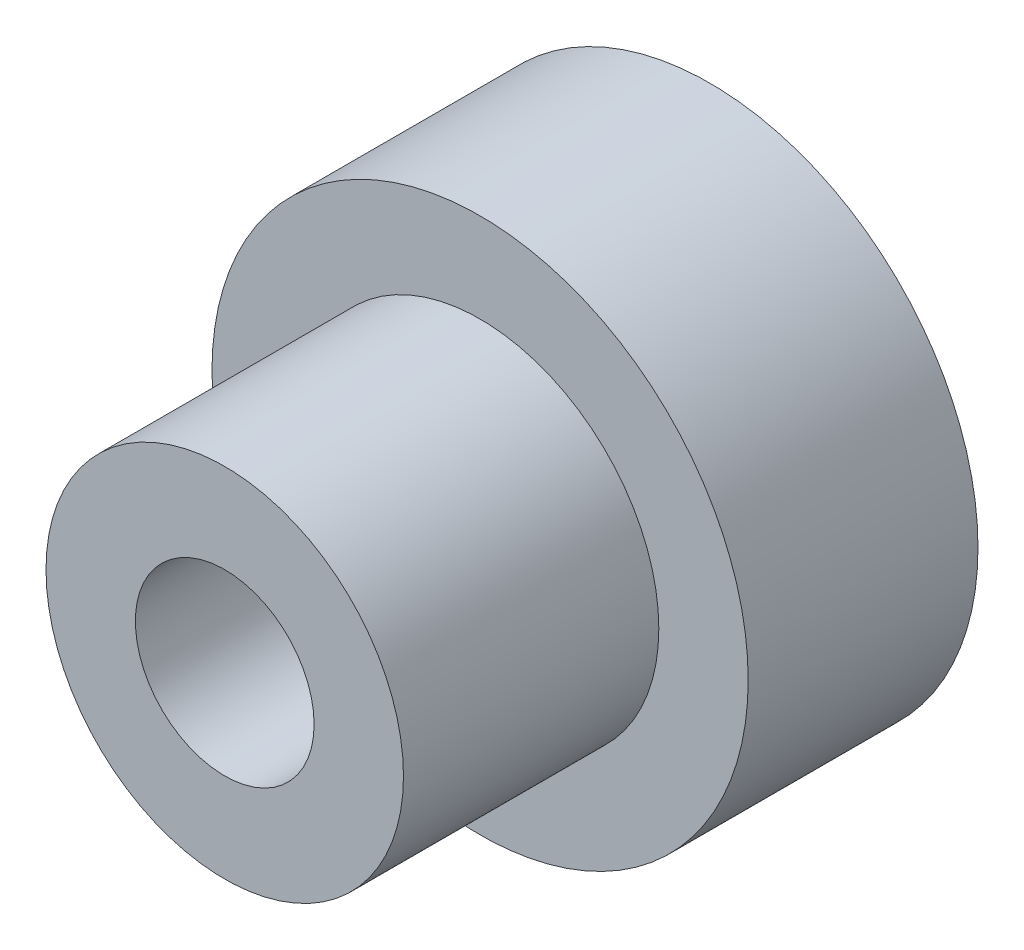
ISO-10303-21;
HEADER;
FILE_DESCRIPTION(('STEP AP214'),'2;1');
FILE_NAME('part.step','',(''),(''),'','','');
FILE_SCHEMA(('AUTOMOTIVE_DESIGN { 1 0 10303 214 1 1 1 1 }'));
ENDSEC;
DATA;
#1=APPLICATION_CONTEXT('core data for automotive mechanical design processes');
#2=APPLICATION_PROTOCOL_DEFINITION('international standard','automotive_design',2000,#1);
#3=PRODUCT_CONTEXT('',#1,'mechanical');
#4=PRODUCT('Part','Part','',(#3));
#5=PRODUCT_RELATED_PRODUCT_CATEGORY('part','',(#4));
#6=PRODUCT_DEFINITION_FORMATION('','',#4);
#7=PRODUCT_DEFINITION_CONTEXT('part definition',#1,'design');
#8=PRODUCT_DEFINITION('design','',#6,#7);
#9=PRODUCT_DEFINITION_SHAPE('','',#8);
#10=(LENGTH_UNIT() NAMED_UNIT(*) SI_UNIT(.MILLI.,.METRE.));
#11=(NAMED_UNIT(*) PLANE_ANGLE_UNIT() SI_UNIT($,.RADIAN.));
#12=(NAMED_UNIT(*) SI_UNIT($,.STERADIAN.) SOLID_ANGLE_UNIT());
#13=UNCERTAINTY_MEASURE_WITH_UNIT(LENGTH_MEASURE(1.E-05),#10,'distance_accuracy_value','');
#14=(GEOMETRIC_REPRESENTATION_CONTEXT(3) GLOBAL_UNCERTAINTY_ASSIGNED_CONTEXT((#13)) GLOBAL_UNIT_ASSIGNED_CONTEXT((#10,
#11,#12)) REPRESENTATION_CONTEXT('',''));
#15=CARTESIAN_POINT('',(0.,0.,0.));
#16=DIRECTION('',(0.,0.,1.));
#17=DIRECTION('',(1.,0.,0.));
#18=AXIS2_PLACEMENT_3D('',#15,#16,#17);
#19=CARTESIAN_POINT('',(0.,0.,-9.));
#20=DIRECTION('',(0.,0.,1.));
#21=DIRECTION('',(1.,0.,0.));
#22=AXIS2_PLACEMENT_3D('',#19,#20,#21);
#23=CYLINDRICAL_SURFACE('',#22,3.5);
#24=CARTESIAN_POINT('',(0.,0.,-9.));
#25=DIRECTION('',(0.,0.,1.));
#26=DIRECTION('',(1.,0.,0.));
#27=AXIS2_PLACEMENT_3D('',#24,#25,#26);
#28=CIRCLE('',#27,3.5);
#29=CARTESIAN_POINT('',(3.5,0.,-9.));
#30=VERTEX_POINT('',#29);
#31=EDGE_CURVE('E65',#30,#30,#28,.T.);
#32=ORIENTED_EDGE('',*,*,#31,.F.);
#33=EDGE_LOOP('',(#32));
#34=FACE_BOUND('',#33,.T.);
#35=CARTESIAN_POINT('',(0.,0.,-5.5));
#36=DIRECTION('',(0.,0.,1.));
#37=DIRECTION('',(1.,0.,0.));
#38=AXIS2_PLACEMENT_3D('',#35,#36,#37);
#39=CIRCLE('',#38,3.5);
#40=CARTESIAN_POINT('',(3.5,0.,-5.5));
#41=VERTEX_POINT('',#40);
#42=EDGE_CURVE('E38',#41,#41,#39,.F.);
#43=ORIENTED_EDGE('',*,*,#42,.F.);
#44=EDGE_LOOP('',(#43));
#45=FACE_BOUND('',#44,.T.);
#46=ADVANCED_FACE('F34',(#34,#45),#23,.F.);
#47=CARTESIAN_POINT('',(0.,0.,10.));
#48=DIRECTION('',(0.,0.,-1.));
#49=DIRECTION('',(-1.,0.,0.));
#50=AXIS2_PLACEMENT_3D('',#47,#48,#49);
#51=CYLINDRICAL_SURFACE('',#50,7.);
#52=CARTESIAN_POINT('',(0.,0.,10.));
#53=DIRECTION('',(0.,0.,1.));
#54=DIRECTION('',(1.,0.,0.));
#55=AXIS2_PLACEMENT_3D('',#52,#53,#54);
#56=CIRCLE('',#55,7.);
#57=CARTESIAN_POINT('',(7.,0.,10.));
#58=VERTEX_POINT('',#57);
#59=EDGE_CURVE('E10',#58,#58,#56,.T.);
#60=ORIENTED_EDGE('',*,*,#59,.F.);
#61=EDGE_LOOP('',(#60));
#62=FACE_BOUND('',#61,.T.);
#63=CARTESIAN_POINT('',(0.,0.,0.));
#64=DIRECTION('',(0.,0.,-1.));
#65=DIRECTION('',(-1.,0.,0.));
#66=AXIS2_PLACEMENT_3D('',#63,#64,#65);
#67=CIRCLE('',#66,7.);
#68=CARTESIAN_POINT('',(-7.,0.,0.));
#69=VERTEX_POINT('',#68);
#70=EDGE_CURVE('E42',#69,#69,#67,.T.);
#71=ORIENTED_EDGE('',*,*,#70,.F.);
#72=EDGE_LOOP('',(#71));
#73=FACE_BOUND('',#72,.T.);
#74=ADVANCED_FACE('F36',(#62,#73),#51,.T.);
#75=CARTESIAN_POINT('',(0.,0.,10.));
#76=DIRECTION('',(0.,0.,1.));
#77=DIRECTION('',(1.,0.,0.));
#78=AXIS2_PLACEMENT_3D('',#75,#76,#77);
#79=PLANE('',#78);
#80=CARTESIAN_POINT('',(0.,0.,10.));
#81=DIRECTION('',(0.,0.,1.));
#82=DIRECTION('',(1.,0.,0.));
#83=AXIS2_PLACEMENT_3D('',#80,#81,#82);
#84=CIRCLE('',#83,3.5);
#85=CARTESIAN_POINT('',(3.5,0.,10.));
#86=VERTEX_POINT('',#85);
#87=EDGE_CURVE('E56',#86,#86,#84,.T.);
#88=ORIENTED_EDGE('',*,*,#87,.F.);
#89=EDGE_LOOP('',(#88));
#90=FACE_BOUND('',#89,.T.);
#91=ORIENTED_EDGE('',*,*,#59,.T.);
#92=EDGE_LOOP('',(#91));
#93=FACE_BOUND('',#92,.T.);
#94=ADVANCED_FACE('F97',(#90,#93),#79,.T.);
#95=CARTESIAN_POINT('',(0.,0.,-9.));
#96=DIRECTION('',(0.,0.,1.));
#97=DIRECTION('',(1.,0.,0.));
#98=AXIS2_PLACEMENT_3D('',#95,#96,#97);
#99=CYLINDRICAL_SURFACE('',#98,10.5);
#100=CARTESIAN_POINT('',(0.,0.,-9.));
#101=DIRECTION('',(0.,0.,-1.));
#102=DIRECTION('',(-1.,0.,0.));
#103=AXIS2_PLACEMENT_3D('',#100,#101,#102);
#104=CIRCLE('',#103,10.5);
#105=CARTESIAN_POINT('',(-10.5,0.,-9.));
#106=VERTEX_POINT('',#105);
#107=EDGE_CURVE('E47',#106,#106,#104,.T.);
#108=ORIENTED_EDGE('',*,*,#107,.F.);
#109=EDGE_LOOP('',(#108));
#110=FACE_BOUND('',#109,.T.);
#111=CARTESIAN_POINT('',(0.,0.,0.));
#112=DIRECTION('',(0.,0.,-1.));
#113=DIRECTION('',(-1.,0.,0.));
#114=AXIS2_PLACEMENT_3D('',#111,#112,#113);
#115=CIRCLE('',#114,10.5);
#116=CARTESIAN_POINT('',(-10.5,0.,0.));
#117=VERTEX_POINT('',#116);
#118=EDGE_CURVE('E68',#117,#117,#115,.T.);
#119=ORIENTED_EDGE('',*,*,#118,.T.);
#120=EDGE_LOOP('',(#119));
#121=FACE_BOUND('',#120,.T.);
#122=ADVANCED_FACE('F75',(#110,#121),#99,.T.);
#123=CARTESIAN_POINT('',(0.,0.,-9.));
#124=DIRECTION('',(0.,0.,-1.));
#125=DIRECTION('',(-1.,0.,0.));
#126=AXIS2_PLACEMENT_3D('',#123,#124,#125);
#127=PLANE('',#126);
#128=ORIENTED_EDGE('',*,*,#31,.T.);
#129=EDGE_LOOP('',(#128));
#130=FACE_BOUND('',#129,.T.);
#131=ORIENTED_EDGE('',*,*,#107,.T.);
#132=EDGE_LOOP('',(#131));
#133=FACE_BOUND('',#132,.T.);
#134=ADVANCED_FACE('F80',(#130,#133),#127,.T.);
#135=CARTESIAN_POINT('',(0.,0.,0.));
#136=DIRECTION('',(0.,0.,-1.));
#137=DIRECTION('',(-1.,0.,0.));
#138=AXIS2_PLACEMENT_3D('',#135,#136,#137);
#139=PLANE('',#138);
#140=ORIENTED_EDGE('',*,*,#70,.T.);
#141=EDGE_LOOP('',(#140));
#142=FACE_BOUND('',#141,.T.);
#143=ORIENTED_EDGE('',*,*,#118,.F.);
#144=EDGE_LOOP('',(#143));
#145=FACE_BOUND('',#144,.T.);
#146=ADVANCED_FACE('F77',(#142,#145),#139,.F.);
#147=CARTESIAN_POINT('',(0.,0.,-3.));
#148=DIRECTION('',(0.,0.,1.));
#149=DIRECTION('',(1.,0.,0.));
#150=AXIS2_PLACEMENT_3D('',#147,#148,#149);
#151=CIRCLE('',#150,3.5);
#152=CARTESIAN_POINT('',(3.5,0.,-3.));
#153=VERTEX_POINT('',#152);
#154=EDGE_CURVE('E50',#153,#153,#151,.F.);
#155=ORIENTED_EDGE('',*,*,#154,.T.);
#156=EDGE_LOOP('',(#155));
#157=FACE_BOUND('',#156,.T.);
#158=ORIENTED_EDGE('',*,*,#87,.T.);
#159=EDGE_LOOP('',(#158));
#160=FACE_BOUND('',#159,.T.);
#161=ADVANCED_FACE('F79',(#157,#160),#23,.F.);
#162=CARTESIAN_POINT('',(0.,0.,-5.5));
#163=DIRECTION('',(0.,0.,1.));
#164=DIRECTION('',(1.,0.,0.));
#165=AXIS2_PLACEMENT_3D('',#162,#163,#164);
#166=PLANE('',#165);
#167=CARTESIAN_POINT('',(0.,0.,-5.5));
#168=DIRECTION('',(0.,0.,1.));
#169=DIRECTION('',(1.,0.,0.));
#170=AXIS2_PLACEMENT_3D('',#167,#168,#169);
#171=CIRCLE('',#170,5.5);
#172=CARTESIAN_POINT('',(5.5,0.,-5.5));
#173=VERTEX_POINT('',#172);
#174=EDGE_CURVE('E52',#173,#173,#171,.T.);
#175=ORIENTED_EDGE('',*,*,#174,.T.);
#176=EDGE_LOOP('',(#175));
#177=FACE_BOUND('',#176,.T.);
#178=ORIENTED_EDGE('',*,*,#42,.T.);
#179=EDGE_LOOP('',(#178));
#180=FACE_BOUND('',#179,.T.);
#181=ADVANCED_FACE('F87',(#177,#180),#166,.T.);
#182=CARTESIAN_POINT('',(0.,0.,-3.));
#183=DIRECTION('',(0.,0.,1.));
#184=DIRECTION('',(1.,0.,0.));
#185=AXIS2_PLACEMENT_3D('',#182,#183,#184);
#186=PLANE('',#185);
#187=CARTESIAN_POINT('',(0.,0.,-3.));
#188=DIRECTION('',(0.,0.,1.));
#189=DIRECTION('',(1.,0.,0.));
#190=AXIS2_PLACEMENT_3D('',#187,#188,#189);
#191=CIRCLE('',#190,5.5);
#192=CARTESIAN_POINT('',(5.5,0.,-3.));
#193=VERTEX_POINT('',#192);
#194=EDGE_CURVE('E58',#193,#193,#191,.T.);
#195=ORIENTED_EDGE('',*,*,#194,.F.);
#196=EDGE_LOOP('',(#195));
#197=FACE_BOUND('',#196,.T.);
#198=ORIENTED_EDGE('',*,*,#154,.F.);
#199=EDGE_LOOP('',(#198));
#200=FACE_BOUND('',#199,.T.);
#201=ADVANCED_FACE('F105',(#197,#200),#186,.F.);
#202=CARTESIAN_POINT('',(0.,0.,-5.5));
#203=DIRECTION('',(0.,0.,1.));
#204=DIRECTION('',(1.,0.,0.));
#205=AXIS2_PLACEMENT_3D('',#202,#203,#204);
#206=CYLINDRICAL_SURFACE('',#205,5.5);
#207=ORIENTED_EDGE('',*,*,#174,.F.);
#208=EDGE_LOOP('',(#207));
#209=FACE_BOUND('',#208,.T.);
#210=ORIENTED_EDGE('',*,*,#194,.T.);
#211=EDGE_LOOP('',(#210));
#212=FACE_BOUND('',#211,.T.);
#213=ADVANCED_FACE('F102',(#209,#212),#206,.F.);
#214=CLOSED_SHELL('',(#46,#74,#94,#122,#134,#146,#161,#181,#201,#213));
#215=MANIFOLD_SOLID_BREP('B2',#214);
#216=ADVANCED_BREP_SHAPE_REPRESENTATION('',(#18,#215),#14);
#217=SHAPE_DEFINITION_REPRESENTATION(#9,#216);
ENDSEC;
END-ISO-10303-21;
